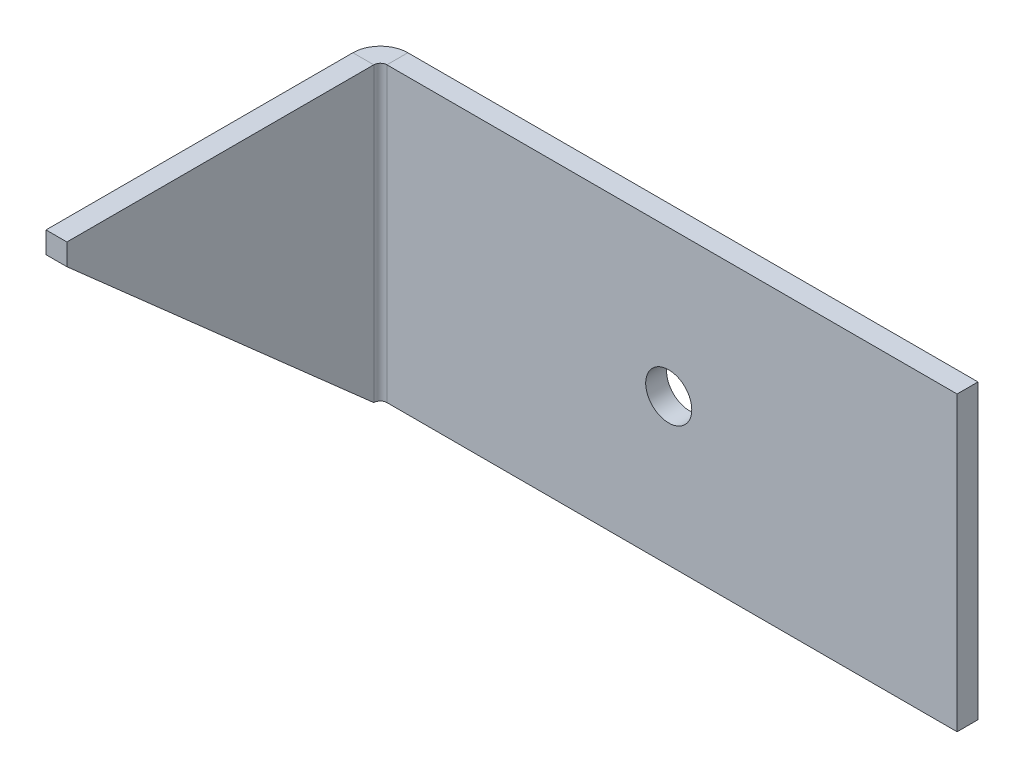
ISO-10303-21;
HEADER;
FILE_DESCRIPTION(('STEP AP214'),'2;1');
FILE_NAME('part.step','',(''),(''),'','','');
FILE_SCHEMA(('AUTOMOTIVE_DESIGN { 1 0 10303 214 1 1 1 1 }'));
ENDSEC;
DATA;
#1=APPLICATION_CONTEXT('core data for automotive mechanical design processes');
#2=APPLICATION_PROTOCOL_DEFINITION('international standard','automotive_design',2000,#1);
#3=PRODUCT_CONTEXT('',#1,'mechanical');
#4=PRODUCT('Part','Part','',(#3));
#5=PRODUCT_RELATED_PRODUCT_CATEGORY('part','',(#4));
#6=PRODUCT_DEFINITION_FORMATION('','',#4);
#7=PRODUCT_DEFINITION_CONTEXT('part definition',#1,'design');
#8=PRODUCT_DEFINITION('design','',#6,#7);
#9=PRODUCT_DEFINITION_SHAPE('','',#8);
#10=(LENGTH_UNIT() NAMED_UNIT(*) SI_UNIT(.MILLI.,.METRE.));
#11=(NAMED_UNIT(*) PLANE_ANGLE_UNIT() SI_UNIT($,.RADIAN.));
#12=(NAMED_UNIT(*) SI_UNIT($,.STERADIAN.) SOLID_ANGLE_UNIT());
#13=UNCERTAINTY_MEASURE_WITH_UNIT(LENGTH_MEASURE(1.E-05),#10,'distance_accuracy_value','');
#14=(GEOMETRIC_REPRESENTATION_CONTEXT(3) GLOBAL_UNCERTAINTY_ASSIGNED_CONTEXT((#13)) GLOBAL_UNIT_ASSIGNED_CONTEXT((#10,
#11,#12)) REPRESENTATION_CONTEXT('',''));
#15=CARTESIAN_POINT('',(0.,0.,0.));
#16=DIRECTION('',(0.,0.,1.));
#17=DIRECTION('',(1.,0.,0.));
#18=AXIS2_PLACEMENT_3D('',#15,#16,#17);
#19=CARTESIAN_POINT('',(0.,0.,0.));
#20=DIRECTION('',(0.,0.,-1.));
#21=DIRECTION('',(-1.,0.,0.));
#22=AXIS2_PLACEMENT_3D('',#19,#20,#21);
#23=PLANE('',#22);
#24=DIRECTION('',(1.,0.,0.));
#25=VECTOR('',#24,1.);
#26=CARTESIAN_POINT('',(-45.4025,-22.225,0.));
#27=LINE('',#26,#25);
#28=CARTESIAN_POINT('',(-41.2275,-22.225,0.));
#29=VERTEX_POINT('',#28);
#30=CARTESIAN_POINT('',(45.4025,-22.225,0.));
#31=VERTEX_POINT('',#30);
#32=EDGE_CURVE('E177',#29,#31,#27,.T.);
#33=ORIENTED_EDGE('',*,*,#32,.F.);
#34=DIRECTION('',(0.,-1.,0.));
#35=VECTOR('',#34,1.);
#36=CARTESIAN_POINT('',(-41.2275,-22.225,0.));
#37=LINE('',#36,#35);
#38=CARTESIAN_POINT('',(-41.2275,22.225,0.));
#39=VERTEX_POINT('',#38);
#40=EDGE_CURVE('E203',#29,#39,#37,.F.);
#41=ORIENTED_EDGE('',*,*,#40,.T.);
#42=DIRECTION('',(-1.,0.,0.));
#43=VECTOR('',#42,1.);
#44=CARTESIAN_POINT('',(-45.4025,22.225,0.));
#45=LINE('',#44,#43);
#46=CARTESIAN_POINT('',(45.4025,22.225,0.));
#47=VERTEX_POINT('',#46);
#48=EDGE_CURVE('E185',#47,#39,#45,.T.);
#49=ORIENTED_EDGE('',*,*,#48,.F.);
#50=DIRECTION('',(0.,1.,0.));
#51=VECTOR('',#50,1.);
#52=CARTESIAN_POINT('',(45.4025,-22.225,0.));
#53=LINE('',#52,#51);
#54=EDGE_CURVE('E171',#31,#47,#53,.T.);
#55=ORIENTED_EDGE('',*,*,#54,.F.);
#56=EDGE_LOOP('',(#33,#41,#49,#55));
#57=FACE_BOUND('',#56,.T.);
#58=CARTESIAN_POINT('',(1.5874999999988,1.33226762955019E-12,0.));
#59=DIRECTION('',(0.,0.,1.));
#60=DIRECTION('',(1.,0.,0.));
#61=AXIS2_PLACEMENT_3D('',#58,#59,#60);
#62=CIRCLE('',#61,3.5);
#63=CARTESIAN_POINT('',(5.0874999999988,1.33226762955019E-12,0.));
#64=VERTEX_POINT('',#63);
#65=EDGE_CURVE('E145',#64,#64,#62,.T.);
#66=ORIENTED_EDGE('',*,*,#65,.T.);
#67=EDGE_LOOP('',(#66));
#68=FACE_BOUND('',#67,.T.);
#69=ADVANCED_FACE('F63',(#57,#68),#23,.T.);
#70=CARTESIAN_POINT('',(-45.4025,0.,-1.69847345772224E-13));
#71=DIRECTION('',(-1.,0.,0.));
#72=DIRECTION('',(0.,0.,1.));
#73=AXIS2_PLACEMENT_3D('',#70,#71,#72);
#74=PLANE('',#73);
#75=DIRECTION('',(0.,-1.,0.));
#76=VECTOR('',#75,1.);
#77=CARTESIAN_POINT('',(-45.4025,0.,4.17499999999998));
#78=LINE('',#77,#76);
#79=CARTESIAN_POINT('',(-45.4025,22.225,4.17499999999998));
#80=VERTEX_POINT('',#79);
#81=CARTESIAN_POINT('',(-45.4025000000001,-22.225,4.17499999999998));
#82=VERTEX_POINT('',#81);
#83=EDGE_CURVE('E134',#80,#82,#78,.T.);
#84=ORIENTED_EDGE('',*,*,#83,.T.);
#85=DIRECTION('',(0.,0.662052306903921,0.749457632507133));
#86=VECTOR('',#85,1.);
#87=CARTESIAN_POINT('',(-45.4025,-14.5550400066229,12.8575617826825));
#88=LINE('',#87,#86);
#89=CARTESIAN_POINT('',(-45.4025000000002,18.96237,50.8));
#90=VERTEX_POINT('',#89);
#91=EDGE_CURVE('E128',#82,#90,#88,.T.);
#92=ORIENTED_EDGE('',*,*,#91,.T.);
#93=DIRECTION('',(0.,-1.,0.));
#94=VECTOR('',#93,1.);
#95=CARTESIAN_POINT('',(-45.4025000000002,-22.225,50.8));
#96=LINE('',#95,#94);
#97=CARTESIAN_POINT('',(-45.4025000000002,22.225,50.8));
#98=VERTEX_POINT('',#97);
#99=EDGE_CURVE('E165',#98,#90,#96,.T.);
#100=ORIENTED_EDGE('',*,*,#99,.F.);
#101=DIRECTION('',(0.,0.,1.));
#102=VECTOR('',#101,1.);
#103=CARTESIAN_POINT('',(-45.4025000000002,22.225,50.8));
#104=LINE('',#103,#102);
#105=EDGE_CURVE('E215',#80,#98,#104,.T.);
#106=ORIENTED_EDGE('',*,*,#105,.F.);
#107=EDGE_LOOP('',(#84,#92,#100,#106));
#108=FACE_BOUND('',#107,.T.);
#109=ADVANCED_FACE('F244',(#108),#74,.T.);
#110=CARTESIAN_POINT('',(-42.2275,0.,-1.58761892521397E-13));
#111=DIRECTION('',(-1.,0.,0.));
#112=DIRECTION('',(0.,0.,1.));
#113=AXIS2_PLACEMENT_3D('',#110,#111,#112);
#114=PLANE('',#113);
#115=DIRECTION('',(0.,-0.662052306903921,-0.749457632507133));
#116=VECTOR('',#115,1.);
#117=CARTESIAN_POINT('',(-42.2275,-14.5550400066229,12.8575617826826));
#118=LINE('',#117,#116);
#119=CARTESIAN_POINT('',(-42.2275000000002,18.96237,50.8));
#120=VERTEX_POINT('',#119);
#121=CARTESIAN_POINT('',(-42.2275,-22.225,4.17499999999999));
#122=VERTEX_POINT('',#121);
#123=EDGE_CURVE('E78',#120,#122,#118,.T.);
#124=ORIENTED_EDGE('',*,*,#123,.T.);
#125=DIRECTION('',(0.,1.,0.));
#126=VECTOR('',#125,1.);
#127=CARTESIAN_POINT('',(-42.2275,22.225,4.17499999999999));
#128=LINE('',#127,#126);
#129=CARTESIAN_POINT('',(-42.2275,22.225,4.17499999999999));
#130=VERTEX_POINT('',#129);
#131=EDGE_CURVE('E135',#130,#122,#128,.F.);
#132=ORIENTED_EDGE('',*,*,#131,.F.);
#133=DIRECTION('',(0.,0.,-1.));
#134=VECTOR('',#133,1.);
#135=CARTESIAN_POINT('',(-42.2275,22.225,-1.55523742032907E-13));
#136=LINE('',#135,#134);
#137=CARTESIAN_POINT('',(-42.2275000000002,22.225,50.8));
#138=VERTEX_POINT('',#137);
#139=EDGE_CURVE('E212',#130,#138,#136,.F.);
#140=ORIENTED_EDGE('',*,*,#139,.T.);
#141=DIRECTION('',(0.,1.,0.));
#142=VECTOR('',#141,1.);
#143=CARTESIAN_POINT('',(-42.2275000000002,0.,50.8));
#144=LINE('',#143,#142);
#145=EDGE_CURVE('E144',#138,#120,#144,.F.);
#146=ORIENTED_EDGE('',*,*,#145,.T.);
#147=EDGE_LOOP('',(#124,#132,#140,#146));
#148=FACE_BOUND('',#147,.T.);
#149=ADVANCED_FACE('F141',(#148),#114,.F.);
#150=CARTESIAN_POINT('',(-45.4025000000002,-22.225,50.8));
#151=DIRECTION('',(0.,0.,1.));
#152=DIRECTION('',(1.,0.,0.));
#153=AXIS2_PLACEMENT_3D('',#150,#151,#152);
#154=PLANE('',#153);
#155=ORIENTED_EDGE('',*,*,#99,.T.);
#156=DIRECTION('',(1.,0.,0.));
#157=VECTOR('',#156,1.);
#158=CARTESIAN_POINT('',(-45.4025000000002,18.96237,50.8));
#159=LINE('',#158,#157);
#160=EDGE_CURVE('E13',#90,#120,#159,.T.);
#161=ORIENTED_EDGE('',*,*,#160,.T.);
#162=ORIENTED_EDGE('',*,*,#145,.F.);
#163=DIRECTION('',(1.,0.,0.));
#164=VECTOR('',#163,1.);
#165=CARTESIAN_POINT('',(-45.4025000000002,22.225,50.8));
#166=LINE('',#165,#164);
#167=EDGE_CURVE('E161',#98,#138,#166,.T.);
#168=ORIENTED_EDGE('',*,*,#167,.F.);
#169=EDGE_LOOP('',(#155,#161,#162,#168));
#170=FACE_BOUND('',#169,.T.);
#171=ADVANCED_FACE('F241',(#170),#154,.T.);
#172=CARTESIAN_POINT('',(-45.4025,22.225,3.175));
#173=DIRECTION('',(0.,-1.,0.));
#174=DIRECTION('',(0.,0.,-1.));
#175=AXIS2_PLACEMENT_3D('',#172,#173,#174);
#176=PLANE('',#175);
#177=DIRECTION('',(0.,0.,-1.));
#178=VECTOR('',#177,1.);
#179=CARTESIAN_POINT('',(-41.2275,22.225,3.17499999999999));
#180=LINE('',#179,#178);
#181=CARTESIAN_POINT('',(-41.2275,22.225,3.17499999999999));
#182=VERTEX_POINT('',#181);
#183=EDGE_CURVE('E169',#182,#39,#180,.T.);
#184=ORIENTED_EDGE('',*,*,#183,.F.);
#185=DIRECTION('',(-1.,0.,0.));
#186=VECTOR('',#185,1.);
#187=CARTESIAN_POINT('',(-45.4025,22.225,3.175));
#188=LINE('',#187,#186);
#189=CARTESIAN_POINT('',(45.4025,22.225,3.175));
#190=VERTEX_POINT('',#189);
#191=EDGE_CURVE('E176',#190,#182,#188,.T.);
#192=ORIENTED_EDGE('',*,*,#191,.F.);
#193=DIRECTION('',(0.,0.,-1.));
#194=VECTOR('',#193,1.);
#195=CARTESIAN_POINT('',(45.4025,22.225,3.175));
#196=LINE('',#195,#194);
#197=EDGE_CURVE('E71',#190,#47,#196,.T.);
#198=ORIENTED_EDGE('',*,*,#197,.T.);
#199=ORIENTED_EDGE('',*,*,#48,.T.);
#200=EDGE_LOOP('',(#184,#192,#198,#199));
#201=FACE_BOUND('',#200,.T.);
#202=ADVANCED_FACE('F194',(#201),#176,.F.);
#203=CARTESIAN_POINT('',(-45.4025,-22.225,3.175));
#204=DIRECTION('',(0.,1.,0.));
#205=DIRECTION('',(0.,0.,1.));
#206=AXIS2_PLACEMENT_3D('',#203,#204,#205);
#207=PLANE('',#206);
#208=DIRECTION('',(0.,0.,-1.));
#209=VECTOR('',#208,1.);
#210=CARTESIAN_POINT('',(-41.2275,-22.225,3.17499999999999));
#211=LINE('',#210,#209);
#212=CARTESIAN_POINT('',(-41.2275,-22.225,3.17499999999999));
#213=VERTEX_POINT('',#212);
#214=EDGE_CURVE('E159',#213,#29,#211,.T.);
#215=ORIENTED_EDGE('',*,*,#214,.T.);
#216=ORIENTED_EDGE('',*,*,#32,.T.);
#217=DIRECTION('',(0.,0.,-1.));
#218=VECTOR('',#217,1.);
#219=CARTESIAN_POINT('',(45.4025,-22.225,3.175));
#220=LINE('',#219,#218);
#221=CARTESIAN_POINT('',(45.4025,-22.225,3.175));
#222=VERTEX_POINT('',#221);
#223=EDGE_CURVE('E182',#222,#31,#220,.T.);
#224=ORIENTED_EDGE('',*,*,#223,.F.);
#225=DIRECTION('',(1.,0.,0.));
#226=VECTOR('',#225,1.);
#227=CARTESIAN_POINT('',(-45.4025,-22.225,3.175));
#228=LINE('',#227,#226);
#229=EDGE_CURVE('E180',#213,#222,#228,.T.);
#230=ORIENTED_EDGE('',*,*,#229,.F.);
#231=EDGE_LOOP('',(#215,#216,#224,#230));
#232=FACE_BOUND('',#231,.T.);
#233=ADVANCED_FACE('F231',(#232),#207,.F.);
#234=CARTESIAN_POINT('',(0.,0.,3.175));
#235=DIRECTION('',(0.,0.,-1.));
#236=DIRECTION('',(-1.,0.,0.));
#237=AXIS2_PLACEMENT_3D('',#234,#235,#236);
#238=PLANE('',#237);
#239=CARTESIAN_POINT('',(1.5874999999988,1.33226762955019E-12,3.175));
#240=DIRECTION('',(0.,0.,1.));
#241=DIRECTION('',(1.,0.,0.));
#242=AXIS2_PLACEMENT_3D('',#239,#240,#241);
#243=CIRCLE('',#242,3.49999999999999);
#244=CARTESIAN_POINT('',(5.08749999999878,1.33226762955019E-12,3.175));
#245=VERTEX_POINT('',#244);
#246=EDGE_CURVE('E222',#245,#245,#243,.T.);
#247=ORIENTED_EDGE('',*,*,#246,.F.);
#248=EDGE_LOOP('',(#247));
#249=FACE_BOUND('',#248,.T.);
#250=DIRECTION('',(0.,-1.,0.));
#251=VECTOR('',#250,1.);
#252=CARTESIAN_POINT('',(-41.2275,-22.225,3.17499999999999));
#253=LINE('',#252,#251);
#254=EDGE_CURVE('E160',#213,#182,#253,.F.);
#255=ORIENTED_EDGE('',*,*,#254,.F.);
#256=ORIENTED_EDGE('',*,*,#229,.T.);
#257=DIRECTION('',(0.,1.,0.));
#258=VECTOR('',#257,1.);
#259=CARTESIAN_POINT('',(45.4025,-22.225,3.175));
#260=LINE('',#259,#258);
#261=EDGE_CURVE('E173',#222,#190,#260,.T.);
#262=ORIENTED_EDGE('',*,*,#261,.T.);
#263=ORIENTED_EDGE('',*,*,#191,.T.);
#264=EDGE_LOOP('',(#255,#256,#262,#263));
#265=FACE_BOUND('',#264,.T.);
#266=ADVANCED_FACE('F228',(#249,#265),#238,.F.);
#267=CARTESIAN_POINT('',(45.4025,-22.225,3.175));
#268=DIRECTION('',(-1.,0.,0.));
#269=DIRECTION('',(0.,0.,1.));
#270=AXIS2_PLACEMENT_3D('',#267,#268,#269);
#271=PLANE('',#270);
#272=ORIENTED_EDGE('',*,*,#54,.T.);
#273=ORIENTED_EDGE('',*,*,#197,.F.);
#274=ORIENTED_EDGE('',*,*,#261,.F.);
#275=ORIENTED_EDGE('',*,*,#223,.T.);
#276=EDGE_LOOP('',(#272,#273,#274,#275));
#277=FACE_BOUND('',#276,.T.);
#278=ADVANCED_FACE('F65',(#277),#271,.F.);
#279=CARTESIAN_POINT('',(-41.2275,22.225,4.17499999999999));
#280=DIRECTION('',(0.,1.,0.));
#281=DIRECTION('',(0.,0.,1.));
#282=AXIS2_PLACEMENT_3D('',#279,#280,#281);
#283=PLANE('',#282);
#284=DIRECTION('',(-1.,0.,0.));
#285=VECTOR('',#284,1.);
#286=CARTESIAN_POINT('',(-45.4025,22.225,4.17499999999998));
#287=LINE('',#286,#285);
#288=EDGE_CURVE('E155',#130,#80,#287,.T.);
#289=ORIENTED_EDGE('',*,*,#288,.F.);
#290=CARTESIAN_POINT('',(-41.2275,22.225,4.17499999999999));
#291=DIRECTION('',(0.,-1.,0.));
#292=DIRECTION('',(0.,0.,-1.));
#293=AXIS2_PLACEMENT_3D('',#290,#291,#292);
#294=CIRCLE('',#293,1.);
#295=EDGE_CURVE('E154',#182,#130,#294,.F.);
#296=ORIENTED_EDGE('',*,*,#295,.F.);
#297=ORIENTED_EDGE('',*,*,#183,.T.);
#298=CARTESIAN_POINT('',(-41.2275,22.225,4.17499999999999));
#299=DIRECTION('',(0.,-1.,0.));
#300=DIRECTION('',(0.,0.,-1.));
#301=AXIS2_PLACEMENT_3D('',#298,#299,#300);
#302=CIRCLE('',#301,4.175);
#303=EDGE_CURVE('E85',#39,#80,#302,.F.);
#304=ORIENTED_EDGE('',*,*,#303,.T.);
#305=EDGE_LOOP('',(#289,#296,#297,#304));
#306=FACE_BOUND('',#305,.T.);
#307=ADVANCED_FACE('F255',(#306),#283,.T.);
#308=CARTESIAN_POINT('',(-41.2275,-22.225,4.17499999999999));
#309=DIRECTION('',(0.,1.,0.));
#310=DIRECTION('',(0.,0.,1.));
#311=AXIS2_PLACEMENT_3D('',#308,#309,#310);
#312=PLANE('',#311);
#313=CARTESIAN_POINT('',(-41.2275,-22.225,4.17499999999999));
#314=DIRECTION('',(0.,-1.,0.));
#315=DIRECTION('',(0.,0.,-1.));
#316=AXIS2_PLACEMENT_3D('',#313,#314,#315);
#317=CIRCLE('',#316,1.);
#318=EDGE_CURVE('E151',#122,#213,#317,.T.);
#319=ORIENTED_EDGE('',*,*,#318,.F.);
#320=DIRECTION('',(-1.,0.,0.));
#321=VECTOR('',#320,1.);
#322=CARTESIAN_POINT('',(-42.2275,-22.225,4.17499999999999));
#323=LINE('',#322,#321);
#324=EDGE_CURVE('E125',#122,#82,#323,.T.);
#325=ORIENTED_EDGE('',*,*,#324,.T.);
#326=CARTESIAN_POINT('',(-41.2275,-22.225,4.17499999999999));
#327=DIRECTION('',(0.,-1.,0.));
#328=DIRECTION('',(0.,0.,-1.));
#329=AXIS2_PLACEMENT_3D('',#326,#327,#328);
#330=CIRCLE('',#329,4.175);
#331=EDGE_CURVE('E204',#82,#29,#330,.T.);
#332=ORIENTED_EDGE('',*,*,#331,.T.);
#333=ORIENTED_EDGE('',*,*,#214,.F.);
#334=EDGE_LOOP('',(#319,#325,#332,#333));
#335=FACE_BOUND('',#334,.T.);
#336=ADVANCED_FACE('F157',(#335),#312,.F.);
#337=CARTESIAN_POINT('',(-41.2275,-22.225,4.17499999999999));
#338=DIRECTION('',(0.,-1.,0.));
#339=DIRECTION('',(-1.,0.,0.));
#340=AXIS2_PLACEMENT_3D('',#337,#338,#339);
#341=CYLINDRICAL_SURFACE('',#340,4.175);
#342=ORIENTED_EDGE('',*,*,#40,.F.);
#343=ORIENTED_EDGE('',*,*,#331,.F.);
#344=ORIENTED_EDGE('',*,*,#83,.F.);
#345=ORIENTED_EDGE('',*,*,#303,.F.);
#346=EDGE_LOOP('',(#342,#343,#344,#345));
#347=FACE_BOUND('',#346,.T.);
#348=ADVANCED_FACE('F254',(#347),#341,.T.);
#349=CARTESIAN_POINT('',(-41.2275,-22.225,4.17499999999999));
#350=DIRECTION('',(0.,-1.,0.));
#351=DIRECTION('',(-1.,0.,0.));
#352=AXIS2_PLACEMENT_3D('',#349,#350,#351);
#353=CYLINDRICAL_SURFACE('',#352,1.);
#354=ORIENTED_EDGE('',*,*,#254,.T.);
#355=ORIENTED_EDGE('',*,*,#295,.T.);
#356=ORIENTED_EDGE('',*,*,#131,.T.);
#357=ORIENTED_EDGE('',*,*,#318,.T.);
#358=EDGE_LOOP('',(#354,#355,#356,#357));
#359=FACE_BOUND('',#358,.T.);
#360=ADVANCED_FACE('F150',(#359),#353,.F.);
#361=CARTESIAN_POINT('',(-45.4025000000002,22.225,50.8));
#362=DIRECTION('',(0.,1.,0.));
#363=DIRECTION('',(0.,0.,1.));
#364=AXIS2_PLACEMENT_3D('',#361,#362,#363);
#365=PLANE('',#364);
#366=ORIENTED_EDGE('',*,*,#139,.F.);
#367=ORIENTED_EDGE('',*,*,#288,.T.);
#368=ORIENTED_EDGE('',*,*,#105,.T.);
#369=ORIENTED_EDGE('',*,*,#167,.T.);
#370=EDGE_LOOP('',(#366,#367,#368,#369));
#371=FACE_BOUND('',#370,.T.);
#372=ADVANCED_FACE('F260',(#371),#365,.T.);
#373=CARTESIAN_POINT('',(-45.402512,-14.5550400066229,12.8575617826825));
#374=DIRECTION('',(0.,-0.749457632507133,0.662052306903921));
#375=DIRECTION('',(0.,-0.662052306903921,-0.749457632507133));
#376=AXIS2_PLACEMENT_3D('',#373,#374,#375);
#377=PLANE('',#376);
#378=ORIENTED_EDGE('',*,*,#324,.F.);
#379=ORIENTED_EDGE('',*,*,#123,.F.);
#380=ORIENTED_EDGE('',*,*,#160,.F.);
#381=ORIENTED_EDGE('',*,*,#91,.F.);
#382=EDGE_LOOP('',(#378,#379,#380,#381));
#383=FACE_BOUND('',#382,.T.);
#384=ADVANCED_FACE('F126',(#383),#377,.T.);
#385=CARTESIAN_POINT('',(1.5874999999988,1.33226762955019E-12,3.175));
#386=DIRECTION('',(0.,0.,1.));
#387=DIRECTION('',(1.,0.,0.));
#388=AXIS2_PLACEMENT_3D('',#385,#386,#387);
#389=CYLINDRICAL_SURFACE('',#388,3.49999999999999);
#390=ORIENTED_EDGE('',*,*,#65,.F.);
#391=EDGE_LOOP('',(#390));
#392=FACE_BOUND('',#391,.T.);
#393=ORIENTED_EDGE('',*,*,#246,.T.);
#394=EDGE_LOOP('',(#393));
#395=FACE_BOUND('',#394,.T.);
#396=ADVANCED_FACE('F226',(#392,#395),#389,.F.);
#397=CLOSED_SHELL('',(#69,#109,#149,#171,#202,#233,#266,#278,#307,#336,#348,#360,#372,#384,#396));
#398=MANIFOLD_SOLID_BREP('B2',#397);
#399=ADVANCED_BREP_SHAPE_REPRESENTATION('',(#18,#398),#14);
#400=SHAPE_DEFINITION_REPRESENTATION(#9,#399);
ENDSEC;
END-ISO-10303-21;
